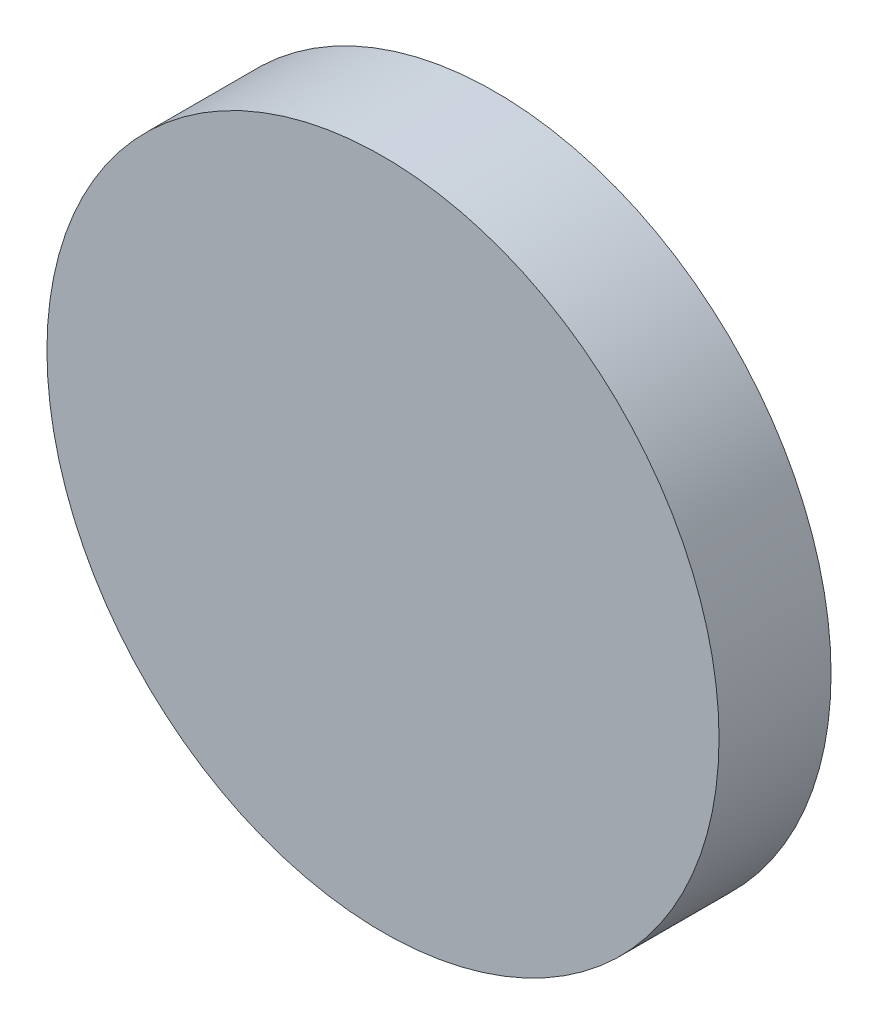
ISO-10303-21;
HEADER;
FILE_DESCRIPTION(('STEP AP214'),'2;1');
FILE_NAME('part.step','',(''),(''),'','','');
FILE_SCHEMA(('AUTOMOTIVE_DESIGN { 1 0 10303 214 1 1 1 1 }'));
ENDSEC;
DATA;
#1=APPLICATION_CONTEXT('core data for automotive mechanical design processes');
#2=APPLICATION_PROTOCOL_DEFINITION('international standard','automotive_design',2000,#1);
#3=PRODUCT_CONTEXT('',#1,'mechanical');
#4=PRODUCT('Part','Part','',(#3));
#5=PRODUCT_RELATED_PRODUCT_CATEGORY('part','',(#4));
#6=PRODUCT_DEFINITION_FORMATION('','',#4);
#7=PRODUCT_DEFINITION_CONTEXT('part definition',#1,'design');
#8=PRODUCT_DEFINITION('design','',#6,#7);
#9=PRODUCT_DEFINITION_SHAPE('','',#8);
#10=(LENGTH_UNIT() NAMED_UNIT(*) SI_UNIT(.MILLI.,.METRE.));
#11=(NAMED_UNIT(*) PLANE_ANGLE_UNIT() SI_UNIT($,.RADIAN.));
#12=(NAMED_UNIT(*) SI_UNIT($,.STERADIAN.) SOLID_ANGLE_UNIT());
#13=UNCERTAINTY_MEASURE_WITH_UNIT(LENGTH_MEASURE(1.E-05),#10,'distance_accuracy_value','');
#14=(GEOMETRIC_REPRESENTATION_CONTEXT(3) GLOBAL_UNCERTAINTY_ASSIGNED_CONTEXT((#13)) GLOBAL_UNIT_ASSIGNED_CONTEXT((#10,
#11,#12)) REPRESENTATION_CONTEXT('',''));
#15=CARTESIAN_POINT('',(0.,0.,0.));
#16=DIRECTION('',(0.,0.,1.));
#17=DIRECTION('',(1.,0.,0.));
#18=AXIS2_PLACEMENT_3D('',#15,#16,#17);
#19=CARTESIAN_POINT('',(0.,0.,12.));
#20=DIRECTION('',(0.,0.,-1.));
#21=DIRECTION('',(-1.,0.,0.));
#22=AXIS2_PLACEMENT_3D('',#19,#20,#21);
#23=CYLINDRICAL_SURFACE('',#22,10.);
#24=CARTESIAN_POINT('',(0.,0.,12.));
#25=DIRECTION('',(0.,0.,1.));
#26=DIRECTION('',(1.,0.,0.));
#27=AXIS2_PLACEMENT_3D('',#24,#25,#26);
#28=CIRCLE('',#27,10.);
#29=CARTESIAN_POINT('',(10.,0.,12.));
#30=VERTEX_POINT('',#29);
#31=EDGE_CURVE('E10',#30,#30,#28,.T.);
#32=ORIENTED_EDGE('',*,*,#31,.F.);
#33=EDGE_LOOP('',(#32));
#34=FACE_BOUND('',#33,.T.);
#35=CARTESIAN_POINT('',(0.,0.,8.66629547095773));
#36=DIRECTION('',(0.,0.,-1.));
#37=DIRECTION('',(-1.,0.,0.));
#38=AXIS2_PLACEMENT_3D('',#35,#36,#37);
#39=CIRCLE('',#38,10.);
#40=CARTESIAN_POINT('',(-10.,0.,8.66629547095773));
#41=VERTEX_POINT('',#40);
#42=EDGE_CURVE('E40',#41,#41,#39,.T.);
#43=ORIENTED_EDGE('',*,*,#42,.F.);
#44=EDGE_LOOP('',(#43));
#45=FACE_BOUND('',#44,.T.);
#46=ADVANCED_FACE('F37',(#34,#45),#23,.T.);
#47=CARTESIAN_POINT('',(0.,0.,12.));
#48=DIRECTION('',(0.,0.,1.));
#49=DIRECTION('',(1.,0.,0.));
#50=AXIS2_PLACEMENT_3D('',#47,#48,#49);
#51=PLANE('',#50);
#52=ORIENTED_EDGE('',*,*,#31,.T.);
#53=EDGE_LOOP('',(#52));
#54=FACE_BOUND('',#53,.T.);
#55=ADVANCED_FACE('F54',(#54),#51,.T.);
#56=CARTESIAN_POINT('',(0.,0.,-141.));
#57=DIRECTION('',(0.,0.,1.));
#58=DIRECTION('',(-1.,0.,0.));
#59=AXIS2_PLACEMENT_3D('',#56,#57,#58);
#60=SPHERICAL_SURFACE('',#59,150.);
#61=ORIENTED_EDGE('',*,*,#42,.T.);
#62=EDGE_LOOP('',(#61));
#63=FACE_BOUND('',#62,.T.);
#64=ADVANCED_FACE('F51',(#63),#60,.F.);
#65=CLOSED_SHELL('',(#46,#55,#64));
#66=MANIFOLD_SOLID_BREP('B2',#65);
#67=ADVANCED_BREP_SHAPE_REPRESENTATION('',(#18,#66),#14);
#68=SHAPE_DEFINITION_REPRESENTATION(#9,#67);
ENDSEC;
END-ISO-10303-21;
